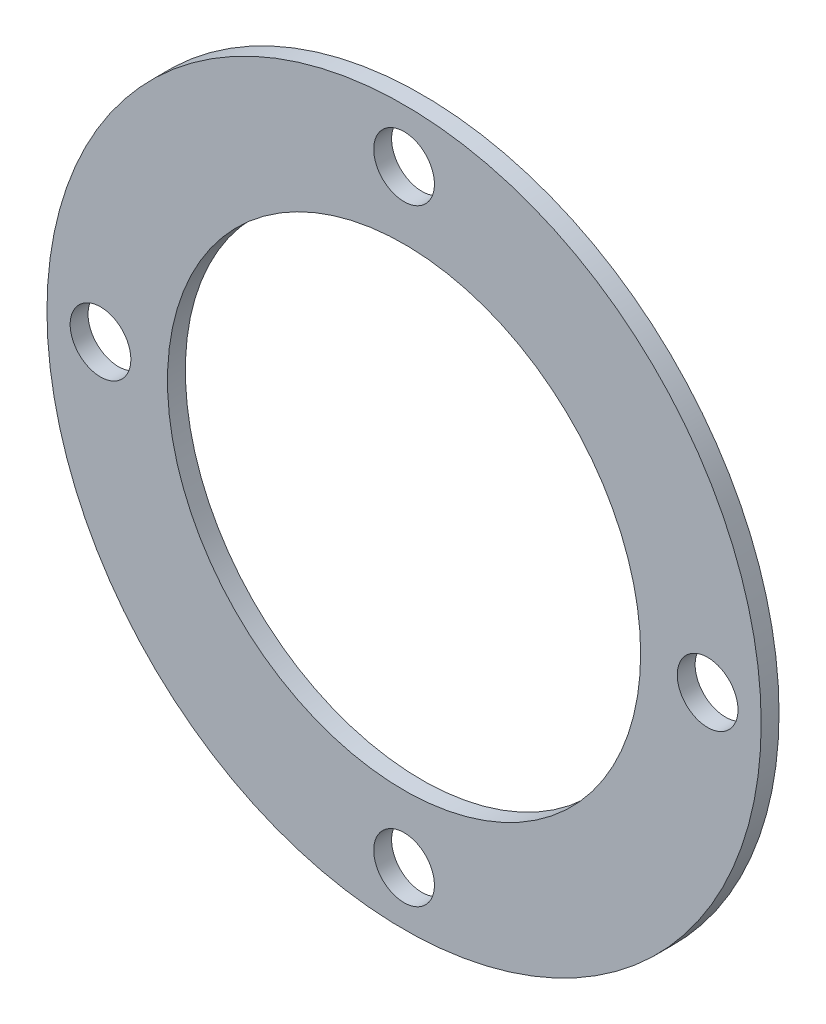
ISO-10303-21;
HEADER;
FILE_DESCRIPTION(('STEP AP214'),'2;1');
FILE_NAME('part.step','',(''),(''),'','','');
FILE_SCHEMA(('AUTOMOTIVE_DESIGN { 1 0 10303 214 1 1 1 1 }'));
ENDSEC;
DATA;
#1=APPLICATION_CONTEXT('core data for automotive mechanical design processes');
#2=APPLICATION_PROTOCOL_DEFINITION('international standard','automotive_design',2000,#1);
#3=PRODUCT_CONTEXT('',#1,'mechanical');
#4=PRODUCT('Part','Part','',(#3));
#5=PRODUCT_RELATED_PRODUCT_CATEGORY('part','',(#4));
#6=PRODUCT_DEFINITION_FORMATION('','',#4);
#7=PRODUCT_DEFINITION_CONTEXT('part definition',#1,'design');
#8=PRODUCT_DEFINITION('design','',#6,#7);
#9=PRODUCT_DEFINITION_SHAPE('','',#8);
#10=(LENGTH_UNIT() NAMED_UNIT(*) SI_UNIT(.MILLI.,.METRE.));
#11=(NAMED_UNIT(*) PLANE_ANGLE_UNIT() SI_UNIT($,.RADIAN.));
#12=(NAMED_UNIT(*) SI_UNIT($,.STERADIAN.) SOLID_ANGLE_UNIT());
#13=UNCERTAINTY_MEASURE_WITH_UNIT(LENGTH_MEASURE(1.E-05),#10,'distance_accuracy_value','');
#14=(GEOMETRIC_REPRESENTATION_CONTEXT(3) GLOBAL_UNCERTAINTY_ASSIGNED_CONTEXT((#13)) GLOBAL_UNIT_ASSIGNED_CONTEXT((#10,
#11,#12)) REPRESENTATION_CONTEXT('',''));
#15=CARTESIAN_POINT('',(0.,0.,0.));
#16=DIRECTION('',(0.,0.,1.));
#17=DIRECTION('',(1.,0.,0.));
#18=AXIS2_PLACEMENT_3D('',#15,#16,#17);
#19=CARTESIAN_POINT('',(0.,0.,1.));
#20=DIRECTION('',(0.,0.,-1.));
#21=DIRECTION('',(-1.,0.,0.));
#22=AXIS2_PLACEMENT_3D('',#19,#20,#21);
#23=CYLINDRICAL_SURFACE('',#22,20.);
#24=CARTESIAN_POINT('',(0.,0.,1.));
#25=DIRECTION('',(0.,0.,1.));
#26=DIRECTION('',(1.,0.,0.));
#27=AXIS2_PLACEMENT_3D('',#24,#25,#26);
#28=CIRCLE('',#27,20.);
#29=CARTESIAN_POINT('',(20.,0.,1.));
#30=VERTEX_POINT('',#29);
#31=EDGE_CURVE('E10',#30,#30,#28,.T.);
#32=ORIENTED_EDGE('',*,*,#31,.F.);
#33=EDGE_LOOP('',(#32));
#34=FACE_BOUND('',#33,.T.);
#35=CARTESIAN_POINT('',(0.,0.,0.));
#36=DIRECTION('',(0.,0.,1.));
#37=DIRECTION('',(1.,0.,0.));
#38=AXIS2_PLACEMENT_3D('',#35,#36,#37);
#39=CIRCLE('',#38,20.);
#40=CARTESIAN_POINT('',(20.,0.,0.));
#41=VERTEX_POINT('',#40);
#42=EDGE_CURVE('E42',#41,#41,#39,.T.);
#43=ORIENTED_EDGE('',*,*,#42,.T.);
#44=EDGE_LOOP('',(#43));
#45=FACE_BOUND('',#44,.T.);
#46=ADVANCED_FACE('F39',(#34,#45),#23,.T.);
#47=CARTESIAN_POINT('',(0.,0.,1.));
#48=DIRECTION('',(0.,0.,1.));
#49=DIRECTION('',(1.,0.,0.));
#50=AXIS2_PLACEMENT_3D('',#47,#48,#49);
#51=PLANE('',#50);
#52=CARTESIAN_POINT('',(0.,17.,1.));
#53=DIRECTION('',(0.,0.,1.));
#54=DIRECTION('',(1.,0.,0.));
#55=AXIS2_PLACEMENT_3D('',#52,#53,#54);
#56=CIRCLE('',#55,1.7);
#57=CARTESIAN_POINT('',(1.7,17.,1.));
#58=VERTEX_POINT('',#57);
#59=EDGE_CURVE('E77',#58,#58,#56,.T.);
#60=ORIENTED_EDGE('',*,*,#59,.F.);
#61=EDGE_LOOP('',(#60));
#62=FACE_BOUND('',#61,.T.);
#63=CARTESIAN_POINT('',(17.,0.,1.));
#64=DIRECTION('',(0.,0.,1.));
#65=DIRECTION('',(1.,0.,0.));
#66=AXIS2_PLACEMENT_3D('',#63,#64,#65);
#67=CIRCLE('',#66,1.7);
#68=CARTESIAN_POINT('',(18.7,0.,1.));
#69=VERTEX_POINT('',#68);
#70=EDGE_CURVE('E71',#69,#69,#67,.T.);
#71=ORIENTED_EDGE('',*,*,#70,.F.);
#72=EDGE_LOOP('',(#71));
#73=FACE_BOUND('',#72,.T.);
#74=CARTESIAN_POINT('',(0.,-17.,1.));
#75=DIRECTION('',(0.,0.,1.));
#76=DIRECTION('',(1.,0.,0.));
#77=AXIS2_PLACEMENT_3D('',#74,#75,#76);
#78=CIRCLE('',#77,1.7);
#79=CARTESIAN_POINT('',(1.7,-17.,1.));
#80=VERTEX_POINT('',#79);
#81=EDGE_CURVE('E65',#80,#80,#78,.T.);
#82=ORIENTED_EDGE('',*,*,#81,.F.);
#83=EDGE_LOOP('',(#82));
#84=FACE_BOUND('',#83,.T.);
#85=CARTESIAN_POINT('',(-17.,0.,1.));
#86=DIRECTION('',(0.,0.,1.));
#87=DIRECTION('',(1.,0.,0.));
#88=AXIS2_PLACEMENT_3D('',#85,#86,#87);
#89=CIRCLE('',#88,1.7);
#90=CARTESIAN_POINT('',(-15.3,0.,1.));
#91=VERTEX_POINT('',#90);
#92=EDGE_CURVE('E59',#91,#91,#89,.T.);
#93=ORIENTED_EDGE('',*,*,#92,.F.);
#94=EDGE_LOOP('',(#93));
#95=FACE_BOUND('',#94,.T.);
#96=CARTESIAN_POINT('',(0.,0.,1.));
#97=DIRECTION('',(0.,0.,1.));
#98=DIRECTION('',(1.,0.,0.));
#99=AXIS2_PLACEMENT_3D('',#96,#97,#98);
#100=CIRCLE('',#99,13.25);
#101=CARTESIAN_POINT('',(13.25,0.,1.));
#102=VERTEX_POINT('',#101);
#103=EDGE_CURVE('E51',#102,#102,#100,.T.);
#104=ORIENTED_EDGE('',*,*,#103,.F.);
#105=EDGE_LOOP('',(#104));
#106=FACE_BOUND('',#105,.T.);
#107=ORIENTED_EDGE('',*,*,#31,.T.);
#108=EDGE_LOOP('',(#107));
#109=FACE_BOUND('',#108,.T.);
#110=ADVANCED_FACE('F83',(#62,#73,#84,#95,#106,#109),#51,.T.);
#111=CARTESIAN_POINT('',(0.,0.,0.));
#112=DIRECTION('',(0.,0.,1.));
#113=DIRECTION('',(1.,0.,0.));
#114=AXIS2_PLACEMENT_3D('',#111,#112,#113);
#115=PLANE('',#114);
#116=CARTESIAN_POINT('',(0.,17.,0.));
#117=DIRECTION('',(0.,0.,1.));
#118=DIRECTION('',(1.,0.,0.));
#119=AXIS2_PLACEMENT_3D('',#116,#117,#118);
#120=CIRCLE('',#119,1.7);
#121=CARTESIAN_POINT('',(1.7,17.,0.));
#122=VERTEX_POINT('',#121);
#123=EDGE_CURVE('E74',#122,#122,#120,.T.);
#124=ORIENTED_EDGE('',*,*,#123,.T.);
#125=EDGE_LOOP('',(#124));
#126=FACE_BOUND('',#125,.T.);
#127=CARTESIAN_POINT('',(17.,0.,0.));
#128=DIRECTION('',(0.,0.,1.));
#129=DIRECTION('',(1.,0.,0.));
#130=AXIS2_PLACEMENT_3D('',#127,#128,#129);
#131=CIRCLE('',#130,1.7);
#132=CARTESIAN_POINT('',(18.7,0.,0.));
#133=VERTEX_POINT('',#132);
#134=EDGE_CURVE('E68',#133,#133,#131,.T.);
#135=ORIENTED_EDGE('',*,*,#134,.T.);
#136=EDGE_LOOP('',(#135));
#137=FACE_BOUND('',#136,.T.);
#138=CARTESIAN_POINT('',(0.,-17.,0.));
#139=DIRECTION('',(0.,0.,1.));
#140=DIRECTION('',(1.,0.,0.));
#141=AXIS2_PLACEMENT_3D('',#138,#139,#140);
#142=CIRCLE('',#141,1.7);
#143=CARTESIAN_POINT('',(1.7,-17.,0.));
#144=VERTEX_POINT('',#143);
#145=EDGE_CURVE('E62',#144,#144,#142,.T.);
#146=ORIENTED_EDGE('',*,*,#145,.T.);
#147=EDGE_LOOP('',(#146));
#148=FACE_BOUND('',#147,.T.);
#149=CARTESIAN_POINT('',(-17.,0.,0.));
#150=DIRECTION('',(0.,0.,1.));
#151=DIRECTION('',(1.,0.,0.));
#152=AXIS2_PLACEMENT_3D('',#149,#150,#151);
#153=CIRCLE('',#152,1.7);
#154=CARTESIAN_POINT('',(-15.3,0.,0.));
#155=VERTEX_POINT('',#154);
#156=EDGE_CURVE('E54',#155,#155,#153,.T.);
#157=ORIENTED_EDGE('',*,*,#156,.T.);
#158=EDGE_LOOP('',(#157));
#159=FACE_BOUND('',#158,.T.);
#160=CARTESIAN_POINT('',(0.,0.,0.));
#161=DIRECTION('',(0.,0.,1.));
#162=DIRECTION('',(1.,0.,0.));
#163=AXIS2_PLACEMENT_3D('',#160,#161,#162);
#164=CIRCLE('',#163,13.25);
#165=CARTESIAN_POINT('',(13.25,0.,0.));
#166=VERTEX_POINT('',#165);
#167=EDGE_CURVE('E49',#166,#166,#164,.T.);
#168=ORIENTED_EDGE('',*,*,#167,.T.);
#169=EDGE_LOOP('',(#168));
#170=FACE_BOUND('',#169,.T.);
#171=ORIENTED_EDGE('',*,*,#42,.F.);
#172=EDGE_LOOP('',(#171));
#173=FACE_BOUND('',#172,.T.);
#174=ADVANCED_FACE('F86',(#126,#137,#148,#159,#170,#173),#115,.F.);
#175=CARTESIAN_POINT('',(0.,0.,0.));
#176=DIRECTION('',(0.,0.,1.));
#177=DIRECTION('',(1.,0.,0.));
#178=AXIS2_PLACEMENT_3D('',#175,#176,#177);
#179=CYLINDRICAL_SURFACE('',#178,13.25);
#180=ORIENTED_EDGE('',*,*,#167,.F.);
#181=EDGE_LOOP('',(#180));
#182=FACE_BOUND('',#181,.T.);
#183=ORIENTED_EDGE('',*,*,#103,.T.);
#184=EDGE_LOOP('',(#183));
#185=FACE_BOUND('',#184,.T.);
#186=ADVANCED_FACE('F96',(#182,#185),#179,.F.);
#187=CARTESIAN_POINT('',(-17.,0.,1.));
#188=DIRECTION('',(0.,0.,1.));
#189=DIRECTION('',(1.,0.,0.));
#190=AXIS2_PLACEMENT_3D('',#187,#188,#189);
#191=CYLINDRICAL_SURFACE('',#190,1.7);
#192=ORIENTED_EDGE('',*,*,#156,.F.);
#193=EDGE_LOOP('',(#192));
#194=FACE_BOUND('',#193,.T.);
#195=ORIENTED_EDGE('',*,*,#92,.T.);
#196=EDGE_LOOP('',(#195));
#197=FACE_BOUND('',#196,.T.);
#198=ADVANCED_FACE('F98',(#194,#197),#191,.F.);
#199=CARTESIAN_POINT('',(0.,-17.,1.));
#200=DIRECTION('',(0.,0.,1.));
#201=DIRECTION('',(1.,0.,0.));
#202=AXIS2_PLACEMENT_3D('',#199,#200,#201);
#203=CYLINDRICAL_SURFACE('',#202,1.7);
#204=ORIENTED_EDGE('',*,*,#145,.F.);
#205=EDGE_LOOP('',(#204));
#206=FACE_BOUND('',#205,.T.);
#207=ORIENTED_EDGE('',*,*,#81,.T.);
#208=EDGE_LOOP('',(#207));
#209=FACE_BOUND('',#208,.T.);
#210=ADVANCED_FACE('F105',(#206,#209),#203,.F.);
#211=CARTESIAN_POINT('',(17.,0.,1.));
#212=DIRECTION('',(0.,0.,1.));
#213=DIRECTION('',(1.,0.,0.));
#214=AXIS2_PLACEMENT_3D('',#211,#212,#213);
#215=CYLINDRICAL_SURFACE('',#214,1.7);
#216=ORIENTED_EDGE('',*,*,#134,.F.);
#217=EDGE_LOOP('',(#216));
#218=FACE_BOUND('',#217,.T.);
#219=ORIENTED_EDGE('',*,*,#70,.T.);
#220=EDGE_LOOP('',(#219));
#221=FACE_BOUND('',#220,.T.);
#222=ADVANCED_FACE('F143',(#218,#221),#215,.F.);
#223=CARTESIAN_POINT('',(0.,17.,1.));
#224=DIRECTION('',(0.,0.,1.));
#225=DIRECTION('',(1.,0.,0.));
#226=AXIS2_PLACEMENT_3D('',#223,#224,#225);
#227=CYLINDRICAL_SURFACE('',#226,1.7);
#228=ORIENTED_EDGE('',*,*,#123,.F.);
#229=EDGE_LOOP('',(#228));
#230=FACE_BOUND('',#229,.T.);
#231=ORIENTED_EDGE('',*,*,#59,.T.);
#232=EDGE_LOOP('',(#231));
#233=FACE_BOUND('',#232,.T.);
#234=ADVANCED_FACE('F81',(#230,#233),#227,.F.);
#235=CLOSED_SHELL('',(#46,#110,#174,#186,#198,#210,#222,#234));
#236=MANIFOLD_SOLID_BREP('B2',#235);
#237=ADVANCED_BREP_SHAPE_REPRESENTATION('',(#18,#236),#14);
#238=SHAPE_DEFINITION_REPRESENTATION(#9,#237);
ENDSEC;
END-ISO-10303-21;
